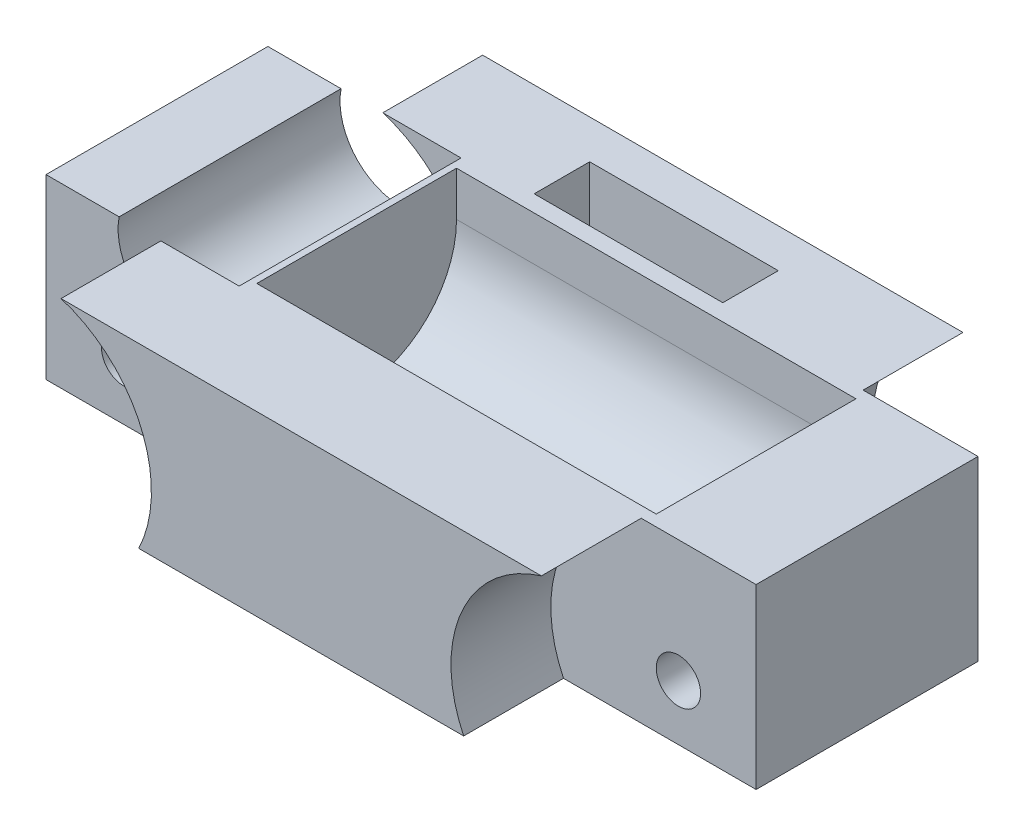
ISO-10303-21;
HEADER;
FILE_DESCRIPTION(('STEP AP214'),'2;1');
FILE_NAME('part.step','',(''),(''),'','','');
FILE_SCHEMA(('AUTOMOTIVE_DESIGN { 1 0 10303 214 1 1 1 1 }'));
ENDSEC;
DATA;
#1=APPLICATION_CONTEXT('core data for automotive mechanical design processes');
#2=APPLICATION_PROTOCOL_DEFINITION('international standard','automotive_design',2000,#1);
#3=PRODUCT_CONTEXT('',#1,'mechanical');
#4=PRODUCT('Part','Part','',(#3));
#5=PRODUCT_RELATED_PRODUCT_CATEGORY('part','',(#4));
#6=PRODUCT_DEFINITION_FORMATION('','',#4);
#7=PRODUCT_DEFINITION_CONTEXT('part definition',#1,'design');
#8=PRODUCT_DEFINITION('design','',#6,#7);
#9=PRODUCT_DEFINITION_SHAPE('','',#8);
#10=(LENGTH_UNIT() NAMED_UNIT(*) SI_UNIT(.MILLI.,.METRE.));
#11=(NAMED_UNIT(*) PLANE_ANGLE_UNIT() SI_UNIT($,.RADIAN.));
#12=(NAMED_UNIT(*) SI_UNIT($,.STERADIAN.) SOLID_ANGLE_UNIT());
#13=UNCERTAINTY_MEASURE_WITH_UNIT(LENGTH_MEASURE(1.E-05),#10,'distance_accuracy_value','');
#14=(GEOMETRIC_REPRESENTATION_CONTEXT(3) GLOBAL_UNCERTAINTY_ASSIGNED_CONTEXT((#13)) GLOBAL_UNIT_ASSIGNED_CONTEXT((#10,
#11,#12)) REPRESENTATION_CONTEXT('',''));
#15=CARTESIAN_POINT('',(0.,0.,0.));
#16=DIRECTION('',(0.,0.,1.));
#17=DIRECTION('',(1.,0.,0.));
#18=AXIS2_PLACEMENT_3D('',#15,#16,#17);
#19=CARTESIAN_POINT('',(0.,16.,0.));
#20=DIRECTION('',(0.,1.,0.));
#21=DIRECTION('',(0.,0.,1.));
#22=AXIS2_PLACEMENT_3D('',#19,#20,#21);
#23=PLANE('',#22);
#24=DIRECTION('',(-1.,0.,0.));
#25=VECTOR('',#24,1.);
#26=CARTESIAN_POINT('',(0.,16.,9.));
#27=LINE('',#26,#25);
#28=CARTESIAN_POINT('',(22.,16.,9.));
#29=VERTEX_POINT('',#28);
#30=CARTESIAN_POINT('',(-14.,16.,9.));
#31=VERTEX_POINT('',#30);
#32=EDGE_CURVE('E440',#29,#31,#27,.T.);
#33=ORIENTED_EDGE('',*,*,#32,.T.);
#34=DIRECTION('',(0.,0.,-1.));
#35=VECTOR('',#34,1.);
#36=CARTESIAN_POINT('',(-14.,16.,0.));
#37=LINE('',#36,#35);
#38=CARTESIAN_POINT('',(-14.,16.,-9.));
#39=VERTEX_POINT('',#38);
#40=EDGE_CURVE('E443',#31,#39,#37,.T.);
#41=ORIENTED_EDGE('',*,*,#40,.T.);
#42=DIRECTION('',(1.,0.,0.));
#43=VECTOR('',#42,1.);
#44=CARTESIAN_POINT('',(0.,16.,-9.));
#45=LINE('',#44,#43);
#46=CARTESIAN_POINT('',(22.,16.,-9.));
#47=VERTEX_POINT('',#46);
#48=EDGE_CURVE('E437',#39,#47,#45,.T.);
#49=ORIENTED_EDGE('',*,*,#48,.T.);
#50=DIRECTION('',(0.,0.,-1.));
#51=VECTOR('',#50,1.);
#52=CARTESIAN_POINT('',(22.,16.,0.));
#53=LINE('',#52,#51);
#54=EDGE_CURVE('E431',#29,#47,#53,.T.);
#55=ORIENTED_EDGE('',*,*,#54,.F.);
#56=EDGE_LOOP('',(#33,#41,#49,#55));
#57=FACE_BOUND('',#56,.T.);
#58=DIRECTION('',(1.,0.,0.));
#59=VECTOR('',#58,1.);
#60=CARTESIAN_POINT('',(8.5,16.,-10.5));
#61=LINE('',#60,#59);
#62=CARTESIAN_POINT('',(-8.5,16.,-10.5));
#63=VERTEX_POINT('',#62);
#64=CARTESIAN_POINT('',(8.5,16.,-10.5));
#65=VERTEX_POINT('',#64);
#66=EDGE_CURVE('E277',#63,#65,#61,.T.);
#67=ORIENTED_EDGE('',*,*,#66,.F.);
#68=DIRECTION('',(0.,0.,1.));
#69=VECTOR('',#68,1.);
#70=CARTESIAN_POINT('',(-8.5,16.,-10.5));
#71=LINE('',#70,#69);
#72=CARTESIAN_POINT('',(-8.5,16.,-15.5));
#73=VERTEX_POINT('',#72);
#74=EDGE_CURVE('E280',#73,#63,#71,.T.);
#75=ORIENTED_EDGE('',*,*,#74,.F.);
#76=DIRECTION('',(-1.,0.,0.));
#77=VECTOR('',#76,1.);
#78=CARTESIAN_POINT('',(8.5,16.,-15.5));
#79=LINE('',#78,#77);
#80=CARTESIAN_POINT('',(8.5,16.,-15.5));
#81=VERTEX_POINT('',#80);
#82=EDGE_CURVE('E309',#81,#73,#79,.T.);
#83=ORIENTED_EDGE('',*,*,#82,.F.);
#84=DIRECTION('',(0.,0.,-1.));
#85=VECTOR('',#84,1.);
#86=CARTESIAN_POINT('',(8.5,16.,-10.5));
#87=LINE('',#86,#85);
#88=EDGE_CURVE('E270',#65,#81,#87,.T.);
#89=ORIENTED_EDGE('',*,*,#88,.F.);
#90=EDGE_LOOP('',(#67,#75,#83,#89));
#91=FACE_BOUND('',#90,.T.);
#92=DIRECTION('',(0.,0.,1.));
#93=VECTOR('',#92,1.);
#94=CARTESIAN_POINT('',(-21.6458980337505,16.,-20.));
#95=LINE('',#94,#93);
#96=CARTESIAN_POINT('',(-21.6458980337505,16.,-10.));
#97=VERTEX_POINT('',#96);
#98=CARTESIAN_POINT('',(-21.6458980337505,16.,-19.));
#99=VERTEX_POINT('',#98);
#100=EDGE_CURVE('E243',#97,#99,#95,.F.);
#101=ORIENTED_EDGE('',*,*,#100,.F.);
#102=DIRECTION('',(1.,0.,0.));
#103=VECTOR('',#102,1.);
#104=CARTESIAN_POINT('',(0.,16.,-10.));
#105=LINE('',#104,#103);
#106=CARTESIAN_POINT('',(-14.591673086804,16.,-10.));
#107=VERTEX_POINT('',#106);
#108=EDGE_CURVE('E235',#97,#107,#105,.T.);
#109=ORIENTED_EDGE('',*,*,#108,.T.);
#110=DIRECTION('',(0.,0.,1.));
#111=VECTOR('',#110,1.);
#112=CARTESIAN_POINT('',(-14.591673086804,16.,-10.));
#113=LINE('',#112,#111);
#114=CARTESIAN_POINT('',(-14.591673086804,16.,10.));
#115=VERTEX_POINT('',#114);
#116=EDGE_CURVE('E224',#115,#107,#113,.F.);
#117=ORIENTED_EDGE('',*,*,#116,.F.);
#118=DIRECTION('',(1.,0.,0.));
#119=VECTOR('',#118,1.);
#120=CARTESIAN_POINT('',(0.,16.,10.));
#121=LINE('',#120,#119);
#122=CARTESIAN_POINT('',(-21.6458980337505,16.,10.));
#123=VERTEX_POINT('',#122);
#124=EDGE_CURVE('E244',#123,#115,#121,.T.);
#125=ORIENTED_EDGE('',*,*,#124,.F.);
#126=DIRECTION('',(0.,0.,-1.));
#127=VECTOR('',#126,1.);
#128=CARTESIAN_POINT('',(-21.6458980337505,16.,20.));
#129=LINE('',#128,#127);
#130=CARTESIAN_POINT('',(-21.6458980337505,16.,19.));
#131=VERTEX_POINT('',#130);
#132=EDGE_CURVE('E370',#123,#131,#129,.F.);
#133=ORIENTED_EDGE('',*,*,#132,.T.);
#134=DIRECTION('',(1.,0.,0.));
#135=VECTOR('',#134,1.);
#136=CARTESIAN_POINT('',(-32.,16.,19.));
#137=LINE('',#136,#135);
#138=CARTESIAN_POINT('',(21.6458980337503,16.,19.));
#139=VERTEX_POINT('',#138);
#140=EDGE_CURVE('E400',#131,#139,#137,.T.);
#141=ORIENTED_EDGE('',*,*,#140,.T.);
#142=DIRECTION('',(0.,0.,-1.));
#143=VECTOR('',#142,1.);
#144=CARTESIAN_POINT('',(21.6458980337503,16.,20.));
#145=LINE('',#144,#143);
#146=CARTESIAN_POINT('',(21.6458980337503,16.,10.));
#147=VERTEX_POINT('',#146);
#148=EDGE_CURVE('E388',#139,#147,#145,.T.);
#149=ORIENTED_EDGE('',*,*,#148,.T.);
#150=DIRECTION('',(1.,0.,0.));
#151=VECTOR('',#150,1.);
#152=CARTESIAN_POINT('',(0.,16.,10.));
#153=LINE('',#152,#151);
#154=CARTESIAN_POINT('',(32.,16.,10.));
#155=VERTEX_POINT('',#154);
#156=EDGE_CURVE('E382',#147,#155,#153,.T.);
#157=ORIENTED_EDGE('',*,*,#156,.T.);
#158=DIRECTION('',(0.,0.,-1.));
#159=VECTOR('',#158,1.);
#160=CARTESIAN_POINT('',(32.,16.,-19.));
#161=LINE('',#160,#159);
#162=CARTESIAN_POINT('',(32.,16.,-10.));
#163=VERTEX_POINT('',#162);
#164=EDGE_CURVE('E392',#155,#163,#161,.T.);
#165=ORIENTED_EDGE('',*,*,#164,.T.);
#166=DIRECTION('',(-1.,0.,0.));
#167=VECTOR('',#166,1.);
#168=CARTESIAN_POINT('',(0.,16.,-10.));
#169=LINE('',#168,#167);
#170=CARTESIAN_POINT('',(21.6458980337503,16.,-10.));
#171=VERTEX_POINT('',#170);
#172=EDGE_CURVE('E361',#163,#171,#169,.T.);
#173=ORIENTED_EDGE('',*,*,#172,.T.);
#174=DIRECTION('',(0.,0.,1.));
#175=VECTOR('',#174,1.);
#176=CARTESIAN_POINT('',(21.6458980337503,16.,-20.));
#177=LINE('',#176,#175);
#178=CARTESIAN_POINT('',(21.6458980337503,16.,-19.));
#179=VERTEX_POINT('',#178);
#180=EDGE_CURVE('E357',#179,#171,#177,.T.);
#181=ORIENTED_EDGE('',*,*,#180,.F.);
#182=DIRECTION('',(-1.,0.,0.));
#183=VECTOR('',#182,1.);
#184=CARTESIAN_POINT('',(-32.,16.,-19.));
#185=LINE('',#184,#183);
#186=EDGE_CURVE('E395',#179,#99,#185,.T.);
#187=ORIENTED_EDGE('',*,*,#186,.T.);
#188=EDGE_LOOP('',(#101,#109,#117,#125,#133,#141,#149,#157,#165,#173,#181,#187));
#189=FACE_BOUND('',#188,.T.);
#190=ADVANCED_FACE('F35',(#57,#91,#189),#23,.T.);
#191=CARTESIAN_POINT('',(0.,3.,0.));
#192=DIRECTION('',(0.,1.,0.));
#193=DIRECTION('',(0.,0.,1.));
#194=AXIS2_PLACEMENT_3D('',#191,#192,#193);
#195=PLANE('',#194);
#196=DIRECTION('',(1.,0.,0.));
#197=VECTOR('',#196,1.);
#198=CARTESIAN_POINT('',(8.5,3.,-10.5));
#199=LINE('',#198,#197);
#200=CARTESIAN_POINT('',(-8.5,3.,-10.5));
#201=VERTEX_POINT('',#200);
#202=CARTESIAN_POINT('',(-6.,3.,-10.5));
#203=VERTEX_POINT('',#202);
#204=EDGE_CURVE('E287',#201,#203,#199,.T.);
#205=ORIENTED_EDGE('',*,*,#204,.T.);
#206=DIRECTION('',(0.,0.,-1.));
#207=VECTOR('',#206,1.);
#208=CARTESIAN_POINT('',(-6.,3.,-17.));
#209=LINE('',#208,#207);
#210=CARTESIAN_POINT('',(-6.,3.,-15.5));
#211=VERTEX_POINT('',#210);
#212=EDGE_CURVE('E250',#203,#211,#209,.T.);
#213=ORIENTED_EDGE('',*,*,#212,.T.);
#214=DIRECTION('',(-1.,0.,0.));
#215=VECTOR('',#214,1.);
#216=CARTESIAN_POINT('',(8.5,3.,-15.5));
#217=LINE('',#216,#215);
#218=CARTESIAN_POINT('',(-8.5,3.,-15.5));
#219=VERTEX_POINT('',#218);
#220=EDGE_CURVE('E294',#211,#219,#217,.T.);
#221=ORIENTED_EDGE('',*,*,#220,.T.);
#222=DIRECTION('',(0.,0.,1.));
#223=VECTOR('',#222,1.);
#224=CARTESIAN_POINT('',(-8.5,3.,-10.5));
#225=LINE('',#224,#223);
#226=EDGE_CURVE('E283',#219,#201,#225,.T.);
#227=ORIENTED_EDGE('',*,*,#226,.T.);
#228=EDGE_LOOP('',(#205,#213,#221,#227));
#229=FACE_BOUND('',#228,.T.);
#230=ADVANCED_FACE('F506',(#229),#195,.T.);
#231=CARTESIAN_POINT('',(8.5,3.,-15.5));
#232=VERTEX_POINT('',#231);
#233=CARTESIAN_POINT('',(6.,3.,-15.5));
#234=VERTEX_POINT('',#233);
#235=EDGE_CURVE('E295',#232,#234,#217,.T.);
#236=ORIENTED_EDGE('',*,*,#235,.T.);
#237=DIRECTION('',(0.,0.,1.));
#238=VECTOR('',#237,1.);
#239=CARTESIAN_POINT('',(6.,3.,-17.));
#240=LINE('',#239,#238);
#241=CARTESIAN_POINT('',(6.,3.,-10.5));
#242=VERTEX_POINT('',#241);
#243=EDGE_CURVE('E253',#234,#242,#240,.T.);
#244=ORIENTED_EDGE('',*,*,#243,.T.);
#245=CARTESIAN_POINT('',(8.5,3.,-10.5));
#246=VERTEX_POINT('',#245);
#247=EDGE_CURVE('E286',#242,#246,#199,.T.);
#248=ORIENTED_EDGE('',*,*,#247,.T.);
#249=DIRECTION('',(0.,0.,-1.));
#250=VECTOR('',#249,1.);
#251=CARTESIAN_POINT('',(8.5,3.,-10.5));
#252=LINE('',#251,#250);
#253=EDGE_CURVE('E290',#246,#232,#252,.T.);
#254=ORIENTED_EDGE('',*,*,#253,.T.);
#255=EDGE_LOOP('',(#236,#244,#248,#254));
#256=FACE_BOUND('',#255,.T.);
#257=ADVANCED_FACE('F471',(#256),#195,.T.);
#258=DIRECTION('',(0.,0.,1.));
#259=VECTOR('',#258,1.);
#260=CARTESIAN_POINT('',(-25.408326913196,16.,-10.));
#261=LINE('',#260,#259);
#262=CARTESIAN_POINT('',(-25.408326913196,16.,-10.));
#263=VERTEX_POINT('',#262);
#264=CARTESIAN_POINT('',(-25.408326913196,16.,10.));
#265=VERTEX_POINT('',#264);
#266=EDGE_CURVE('E231',#263,#265,#261,.T.);
#267=ORIENTED_EDGE('',*,*,#266,.F.);
#268=DIRECTION('',(-1.,0.,0.));
#269=VECTOR('',#268,1.);
#270=CARTESIAN_POINT('',(0.,16.,-10.));
#271=LINE('',#270,#269);
#272=CARTESIAN_POINT('',(-32.,16.,-10.));
#273=VERTEX_POINT('',#272);
#274=EDGE_CURVE('E349',#263,#273,#271,.T.);
#275=ORIENTED_EDGE('',*,*,#274,.T.);
#276=DIRECTION('',(0.,0.,1.));
#277=VECTOR('',#276,1.);
#278=CARTESIAN_POINT('',(-32.,16.,-19.));
#279=LINE('',#278,#277);
#280=CARTESIAN_POINT('',(-32.,16.,10.));
#281=VERTEX_POINT('',#280);
#282=EDGE_CURVE('E398',#273,#281,#279,.T.);
#283=ORIENTED_EDGE('',*,*,#282,.T.);
#284=DIRECTION('',(1.,0.,0.));
#285=VECTOR('',#284,1.);
#286=CARTESIAN_POINT('',(0.,16.,10.));
#287=LINE('',#286,#285);
#288=EDGE_CURVE('E375',#281,#265,#287,.T.);
#289=ORIENTED_EDGE('',*,*,#288,.T.);
#290=EDGE_LOOP('',(#267,#275,#283,#289));
#291=FACE_BOUND('',#290,.T.);
#292=ADVANCED_FACE('F512',(#291),#23,.T.);
#293=CARTESIAN_POINT('',(-32.,16.,-19.));
#294=DIRECTION('',(1.,0.,0.));
#295=DIRECTION('',(0.,0.,-1.));
#296=AXIS2_PLACEMENT_3D('',#293,#294,#295);
#297=PLANE('',#296);
#298=DIRECTION('',(0.,1.,0.));
#299=VECTOR('',#298,1.);
#300=CARTESIAN_POINT('',(-32.,16.,-10.));
#301=LINE('',#300,#299);
#302=CARTESIAN_POINT('',(-32.,0.,-10.));
#303=VERTEX_POINT('',#302);
#304=EDGE_CURVE('E428',#303,#273,#301,.T.);
#305=ORIENTED_EDGE('',*,*,#304,.F.);
#306=DIRECTION('',(0.,0.,1.));
#307=VECTOR('',#306,1.);
#308=CARTESIAN_POINT('',(-32.,0.,-19.));
#309=LINE('',#308,#307);
#310=CARTESIAN_POINT('',(-32.,0.,10.));
#311=VERTEX_POINT('',#310);
#312=EDGE_CURVE('E408',#303,#311,#309,.T.);
#313=ORIENTED_EDGE('',*,*,#312,.T.);
#314=DIRECTION('',(0.,-1.,0.));
#315=VECTOR('',#314,1.);
#316=CARTESIAN_POINT('',(-32.,16.,10.));
#317=LINE('',#316,#315);
#318=EDGE_CURVE('E417',#281,#311,#317,.T.);
#319=ORIENTED_EDGE('',*,*,#318,.F.);
#320=ORIENTED_EDGE('',*,*,#282,.F.);
#321=EDGE_LOOP('',(#305,#313,#319,#320));
#322=FACE_BOUND('',#321,.T.);
#323=ADVANCED_FACE('F589',(#322),#297,.F.);
#324=CARTESIAN_POINT('',(32.,16.,-19.));
#325=DIRECTION('',(-1.,0.,0.));
#326=DIRECTION('',(0.,0.,1.));
#327=AXIS2_PLACEMENT_3D('',#324,#325,#326);
#328=PLANE('',#327);
#329=DIRECTION('',(0.,-1.,0.));
#330=VECTOR('',#329,1.);
#331=CARTESIAN_POINT('',(32.,16.,-10.));
#332=LINE('',#331,#330);
#333=CARTESIAN_POINT('',(32.,0.,-10.));
#334=VERTEX_POINT('',#333);
#335=EDGE_CURVE('E423',#163,#334,#332,.T.);
#336=ORIENTED_EDGE('',*,*,#335,.F.);
#337=ORIENTED_EDGE('',*,*,#164,.F.);
#338=DIRECTION('',(0.,1.,0.));
#339=VECTOR('',#338,1.);
#340=CARTESIAN_POINT('',(32.,16.,10.));
#341=LINE('',#340,#339);
#342=CARTESIAN_POINT('',(32.,0.,10.));
#343=VERTEX_POINT('',#342);
#344=EDGE_CURVE('E380',#343,#155,#341,.T.);
#345=ORIENTED_EDGE('',*,*,#344,.F.);
#346=DIRECTION('',(0.,0.,-1.));
#347=VECTOR('',#346,1.);
#348=CARTESIAN_POINT('',(32.,0.,-19.));
#349=LINE('',#348,#347);
#350=EDGE_CURVE('E391',#343,#334,#349,.T.);
#351=ORIENTED_EDGE('',*,*,#350,.T.);
#352=EDGE_LOOP('',(#336,#337,#345,#351));
#353=FACE_BOUND('',#352,.T.);
#354=ADVANCED_FACE('F594',(#353),#328,.F.);
#355=CARTESIAN_POINT('',(0.,0.,0.));
#356=DIRECTION('',(0.,1.,0.));
#357=DIRECTION('',(0.,0.,1.));
#358=AXIS2_PLACEMENT_3D('',#355,#356,#357);
#359=PLANE('',#358);
#360=DIRECTION('',(1.,0.,0.));
#361=VECTOR('',#360,1.);
#362=CARTESIAN_POINT('',(6.,0.,-17.));
#363=LINE('',#362,#361);
#364=CARTESIAN_POINT('',(-6.,0.,-17.));
#365=VERTEX_POINT('',#364);
#366=CARTESIAN_POINT('',(6.,0.,-17.));
#367=VERTEX_POINT('',#366);
#368=EDGE_CURVE('E260',#365,#367,#363,.T.);
#369=ORIENTED_EDGE('',*,*,#368,.F.);
#370=DIRECTION('',(0.,0.,-1.));
#371=VECTOR('',#370,1.);
#372=CARTESIAN_POINT('',(-6.,0.,-17.));
#373=LINE('',#372,#371);
#374=CARTESIAN_POINT('',(-6.,0.,-9.));
#375=VERTEX_POINT('',#374);
#376=EDGE_CURVE('E246',#375,#365,#373,.T.);
#377=ORIENTED_EDGE('',*,*,#376,.F.);
#378=DIRECTION('',(-1.,0.,0.));
#379=VECTOR('',#378,1.);
#380=CARTESIAN_POINT('',(6.,0.,-9.));
#381=LINE('',#380,#379);
#382=CARTESIAN_POINT('',(6.,0.,-9.));
#383=VERTEX_POINT('',#382);
#384=EDGE_CURVE('E254',#383,#375,#381,.T.);
#385=ORIENTED_EDGE('',*,*,#384,.F.);
#386=DIRECTION('',(0.,0.,1.));
#387=VECTOR('',#386,1.);
#388=CARTESIAN_POINT('',(6.,0.,-17.));
#389=LINE('',#388,#387);
#390=EDGE_CURVE('E263',#367,#383,#389,.T.);
#391=ORIENTED_EDGE('',*,*,#390,.F.);
#392=EDGE_LOOP('',(#369,#377,#385,#391));
#393=FACE_BOUND('',#392,.T.);
#394=DIRECTION('',(-1.,0.,0.));
#395=VECTOR('',#394,1.);
#396=CARTESIAN_POINT('',(0.,0.,-10.));
#397=LINE('',#396,#395);
#398=CARTESIAN_POINT('',(-14.643842411396,0.,-10.));
#399=VERTEX_POINT('',#398);
#400=EDGE_CURVE('E347',#399,#303,#397,.T.);
#401=ORIENTED_EDGE('',*,*,#400,.F.);
#402=DIRECTION('',(0.,0.,1.));
#403=VECTOR('',#402,1.);
#404=CARTESIAN_POINT('',(-14.643842411396,0.,-20.));
#405=LINE('',#404,#403);
#406=CARTESIAN_POINT('',(-14.643842411396,0.,-19.));
#407=VERTEX_POINT('',#406);
#408=EDGE_CURVE('E343',#399,#407,#405,.F.);
#409=ORIENTED_EDGE('',*,*,#408,.T.);
#410=DIRECTION('',(-1.,0.,0.));
#411=VECTOR('',#410,1.);
#412=CARTESIAN_POINT('',(-32.,0.,-19.));
#413=LINE('',#412,#411);
#414=CARTESIAN_POINT('',(14.643842411396,0.,-19.));
#415=VERTEX_POINT('',#414);
#416=EDGE_CURVE('E405',#415,#407,#413,.T.);
#417=ORIENTED_EDGE('',*,*,#416,.F.);
#418=DIRECTION('',(0.,0.,1.));
#419=VECTOR('',#418,1.);
#420=CARTESIAN_POINT('',(14.643842411396,0.,-20.));
#421=LINE('',#420,#419);
#422=CARTESIAN_POINT('',(14.643842411396,0.,-10.));
#423=VERTEX_POINT('',#422);
#424=EDGE_CURVE('E354',#415,#423,#421,.T.);
#425=ORIENTED_EDGE('',*,*,#424,.T.);
#426=DIRECTION('',(-1.,0.,0.));
#427=VECTOR('',#426,1.);
#428=CARTESIAN_POINT('',(0.,0.,-10.));
#429=LINE('',#428,#427);
#430=EDGE_CURVE('E359',#334,#423,#429,.T.);
#431=ORIENTED_EDGE('',*,*,#430,.F.);
#432=ORIENTED_EDGE('',*,*,#350,.F.);
#433=DIRECTION('',(1.,0.,0.));
#434=VECTOR('',#433,1.);
#435=CARTESIAN_POINT('',(0.,0.,10.));
#436=LINE('',#435,#434);
#437=CARTESIAN_POINT('',(14.643842411396,0.,10.));
#438=VERTEX_POINT('',#437);
#439=EDGE_CURVE('E402',#438,#343,#436,.T.);
#440=ORIENTED_EDGE('',*,*,#439,.F.);
#441=DIRECTION('',(0.,0.,-1.));
#442=VECTOR('',#441,1.);
#443=CARTESIAN_POINT('',(14.643842411396,0.,20.));
#444=LINE('',#443,#442);
#445=CARTESIAN_POINT('',(14.643842411396,0.,19.));
#446=VERTEX_POINT('',#445);
#447=EDGE_CURVE('E412',#446,#438,#444,.T.);
#448=ORIENTED_EDGE('',*,*,#447,.F.);
#449=DIRECTION('',(1.,0.,0.));
#450=VECTOR('',#449,1.);
#451=CARTESIAN_POINT('',(-32.,0.,19.));
#452=LINE('',#451,#450);
#453=CARTESIAN_POINT('',(-14.643842411396,0.,19.));
#454=VERTEX_POINT('',#453);
#455=EDGE_CURVE('E396',#454,#446,#452,.T.);
#456=ORIENTED_EDGE('',*,*,#455,.F.);
#457=DIRECTION('',(0.,0.,-1.));
#458=VECTOR('',#457,1.);
#459=CARTESIAN_POINT('',(-14.643842411396,0.,20.));
#460=LINE('',#459,#458);
#461=CARTESIAN_POINT('',(-14.643842411396,0.,10.));
#462=VERTEX_POINT('',#461);
#463=EDGE_CURVE('E368',#462,#454,#460,.F.);
#464=ORIENTED_EDGE('',*,*,#463,.F.);
#465=DIRECTION('',(1.,0.,0.));
#466=VECTOR('',#465,1.);
#467=CARTESIAN_POINT('',(0.,0.,10.));
#468=LINE('',#467,#466);
#469=EDGE_CURVE('E373',#311,#462,#468,.T.);
#470=ORIENTED_EDGE('',*,*,#469,.F.);
#471=ORIENTED_EDGE('',*,*,#312,.F.);
#472=EDGE_LOOP('',(#401,#409,#417,#425,#431,#432,#440,#448,#456,#464,#470,#471));
#473=FACE_BOUND('',#472,.T.);
#474=ADVANCED_FACE('F503',(#393,#473),#359,.F.);
#475=CARTESIAN_POINT('',(-32.,16.,-19.));
#476=DIRECTION('',(0.,0.,1.));
#477=DIRECTION('',(1.,0.,0.));
#478=AXIS2_PLACEMENT_3D('',#475,#476,#477);
#479=PLANE('',#478);
#480=ORIENTED_EDGE('',*,*,#416,.T.);
#481=CARTESIAN_POINT('',(-25.,4.99999999999993,-19.));
#482=DIRECTION('',(0.,0.,1.));
#483=DIRECTION('',(1.,0.,0.));
#484=AXIS2_PLACEMENT_3D('',#481,#482,#483);
#485=CIRCLE('',#484,11.5);
#486=EDGE_CURVE('E425',#407,#99,#485,.T.);
#487=ORIENTED_EDGE('',*,*,#486,.T.);
#488=ORIENTED_EDGE('',*,*,#186,.F.);
#489=CARTESIAN_POINT('',(25.,5.,-19.));
#490=DIRECTION('',(0.,0.,1.));
#491=DIRECTION('',(1.,0.,0.));
#492=AXIS2_PLACEMENT_3D('',#489,#490,#491);
#493=CIRCLE('',#492,11.5);
#494=EDGE_CURVE('E420',#179,#415,#493,.T.);
#495=ORIENTED_EDGE('',*,*,#494,.T.);
#496=EDGE_LOOP('',(#480,#487,#488,#495));
#497=FACE_BOUND('',#496,.T.);
#498=ADVANCED_FACE('F593',(#497),#479,.F.);
#499=CARTESIAN_POINT('',(-32.,16.,19.));
#500=DIRECTION('',(0.,0.,-1.));
#501=DIRECTION('',(-1.,0.,0.));
#502=AXIS2_PLACEMENT_3D('',#499,#500,#501);
#503=PLANE('',#502);
#504=CARTESIAN_POINT('',(-25.,4.99999999999993,19.));
#505=DIRECTION('',(0.,0.,-1.));
#506=DIRECTION('',(-1.,0.,0.));
#507=AXIS2_PLACEMENT_3D('',#504,#505,#506);
#508=CIRCLE('',#507,11.5);
#509=EDGE_CURVE('E415',#454,#131,#508,.F.);
#510=ORIENTED_EDGE('',*,*,#509,.F.);
#511=ORIENTED_EDGE('',*,*,#455,.T.);
#512=CARTESIAN_POINT('',(25.,5.,19.));
#513=DIRECTION('',(0.,0.,-1.));
#514=DIRECTION('',(-1.,0.,0.));
#515=AXIS2_PLACEMENT_3D('',#512,#513,#514);
#516=CIRCLE('',#515,11.5);
#517=EDGE_CURVE('E385',#139,#446,#516,.F.);
#518=ORIENTED_EDGE('',*,*,#517,.F.);
#519=ORIENTED_EDGE('',*,*,#140,.F.);
#520=EDGE_LOOP('',(#510,#511,#518,#519));
#521=FACE_BOUND('',#520,.T.);
#522=ADVANCED_FACE('F585',(#521),#503,.F.);
#523=CARTESIAN_POINT('',(25.,5.,20.));
#524=DIRECTION('',(0.,0.,-1.));
#525=DIRECTION('',(-1.,0.,0.));
#526=AXIS2_PLACEMENT_3D('',#523,#524,#525);
#527=CYLINDRICAL_SURFACE('',#526,11.5);
#528=ORIENTED_EDGE('',*,*,#517,.T.);
#529=ORIENTED_EDGE('',*,*,#447,.T.);
#530=CARTESIAN_POINT('',(25.,5.,10.));
#531=DIRECTION('',(0.,0.,1.));
#532=DIRECTION('',(1.,0.,0.));
#533=AXIS2_PLACEMENT_3D('',#530,#531,#532);
#534=CIRCLE('',#533,11.5);
#535=EDGE_CURVE('E378',#147,#438,#534,.T.);
#536=ORIENTED_EDGE('',*,*,#535,.F.);
#537=ORIENTED_EDGE('',*,*,#148,.F.);
#538=EDGE_LOOP('',(#528,#529,#536,#537));
#539=FACE_BOUND('',#538,.T.);
#540=ADVANCED_FACE('F582',(#539),#527,.F.);
#541=CARTESIAN_POINT('',(0.,0.,10.));
#542=DIRECTION('',(0.,0.,1.));
#543=DIRECTION('',(1.,0.,0.));
#544=AXIS2_PLACEMENT_3D('',#541,#542,#543);
#545=PLANE('',#544);
#546=CARTESIAN_POINT('',(25.,5.,10.));
#547=DIRECTION('',(0.,0.,1.));
#548=DIRECTION('',(1.,0.,0.));
#549=AXIS2_PLACEMENT_3D('',#546,#547,#548);
#550=CIRCLE('',#549,2.);
#551=CARTESIAN_POINT('',(27.,5.,10.));
#552=VERTEX_POINT('',#551);
#553=EDGE_CURVE('E337',#552,#552,#550,.T.);
#554=ORIENTED_EDGE('',*,*,#553,.F.);
#555=EDGE_LOOP('',(#554));
#556=FACE_BOUND('',#555,.T.);
#557=ORIENTED_EDGE('',*,*,#535,.T.);
#558=ORIENTED_EDGE('',*,*,#439,.T.);
#559=ORIENTED_EDGE('',*,*,#344,.T.);
#560=ORIENTED_EDGE('',*,*,#156,.F.);
#561=EDGE_LOOP('',(#557,#558,#559,#560));
#562=FACE_BOUND('',#561,.T.);
#563=ADVANCED_FACE('F578',(#556,#562),#545,.T.);
#564=CARTESIAN_POINT('',(-25.,4.99999999999993,20.));
#565=DIRECTION('',(0.,0.,-1.));
#566=DIRECTION('',(-1.,0.,0.));
#567=AXIS2_PLACEMENT_3D('',#564,#565,#566);
#568=CYLINDRICAL_SURFACE('',#567,11.5);
#569=CARTESIAN_POINT('',(-25.,4.99999999999993,10.));
#570=DIRECTION('',(0.,0.,1.));
#571=DIRECTION('',(1.,0.,0.));
#572=AXIS2_PLACEMENT_3D('',#569,#570,#571);
#573=CIRCLE('',#572,11.5);
#574=CARTESIAN_POINT('',(-15.6274437406276,11.6637218703137,10.));
#575=VERTEX_POINT('',#574);
#576=EDGE_CURVE('E365',#462,#575,#573,.T.);
#577=ORIENTED_EDGE('',*,*,#576,.F.);
#578=ORIENTED_EDGE('',*,*,#463,.T.);
#579=ORIENTED_EDGE('',*,*,#509,.T.);
#580=ORIENTED_EDGE('',*,*,#132,.F.);
#581=EDGE_CURVE('E364',#575,#123,#573,.T.);
#582=ORIENTED_EDGE('',*,*,#581,.F.);
#583=EDGE_LOOP('',(#577,#578,#579,#580,#582));
#584=FACE_BOUND('',#583,.T.);
#585=ADVANCED_FACE('F574',(#584),#568,.F.);
#586=CARTESIAN_POINT('',(0.,0.,10.));
#587=DIRECTION('',(0.,0.,1.));
#588=DIRECTION('',(1.,0.,0.));
#589=AXIS2_PLACEMENT_3D('',#586,#587,#588);
#590=PLANE('',#589);
#591=CARTESIAN_POINT('',(-20.,15.,10.));
#592=DIRECTION('',(0.,0.,1.));
#593=DIRECTION('',(1.,0.,0.));
#594=AXIS2_PLACEMENT_3D('',#591,#592,#593);
#595=CIRCLE('',#594,5.5);
#596=EDGE_CURVE('E239',#265,#575,#595,.T.);
#597=ORIENTED_EDGE('',*,*,#596,.F.);
#598=ORIENTED_EDGE('',*,*,#288,.F.);
#599=ORIENTED_EDGE('',*,*,#318,.T.);
#600=ORIENTED_EDGE('',*,*,#469,.T.);
#601=ORIENTED_EDGE('',*,*,#576,.T.);
#602=EDGE_LOOP('',(#597,#598,#599,#600,#601));
#603=FACE_BOUND('',#602,.T.);
#604=CARTESIAN_POINT('',(-25.,4.99999999999993,10.));
#605=DIRECTION('',(0.,0.,1.));
#606=DIRECTION('',(1.,0.,0.));
#607=AXIS2_PLACEMENT_3D('',#604,#605,#606);
#608=CIRCLE('',#607,2.);
#609=CARTESIAN_POINT('',(-23.,4.99999999999993,10.));
#610=VERTEX_POINT('',#609);
#611=EDGE_CURVE('E333',#610,#610,#608,.T.);
#612=ORIENTED_EDGE('',*,*,#611,.F.);
#613=EDGE_LOOP('',(#612));
#614=FACE_BOUND('',#613,.T.);
#615=ADVANCED_FACE('F570',(#603,#614),#590,.T.);
#616=CARTESIAN_POINT('',(25.,5.,-20.));
#617=DIRECTION('',(0.,0.,1.));
#618=DIRECTION('',(1.,0.,0.));
#619=AXIS2_PLACEMENT_3D('',#616,#617,#618);
#620=CYLINDRICAL_SURFACE('',#619,11.5);
#621=ORIENTED_EDGE('',*,*,#180,.T.);
#622=CARTESIAN_POINT('',(25.,5.,-10.));
#623=DIRECTION('',(0.,0.,1.));
#624=DIRECTION('',(1.,0.,0.));
#625=AXIS2_PLACEMENT_3D('',#622,#623,#624);
#626=CIRCLE('',#625,11.5);
#627=EDGE_CURVE('E351',#171,#423,#626,.T.);
#628=ORIENTED_EDGE('',*,*,#627,.T.);
#629=ORIENTED_EDGE('',*,*,#424,.F.);
#630=ORIENTED_EDGE('',*,*,#494,.F.);
#631=EDGE_LOOP('',(#621,#628,#629,#630));
#632=FACE_BOUND('',#631,.T.);
#633=ADVANCED_FACE('F566',(#632),#620,.F.);
#634=CARTESIAN_POINT('',(0.,0.,-10.));
#635=DIRECTION('',(0.,0.,-1.));
#636=DIRECTION('',(1.,0.,0.));
#637=AXIS2_PLACEMENT_3D('',#634,#635,#636);
#638=PLANE('',#637);
#639=CARTESIAN_POINT('',(25.,5.,-10.));
#640=DIRECTION('',(0.,0.,-1.));
#641=DIRECTION('',(-1.,0.,0.));
#642=AXIS2_PLACEMENT_3D('',#639,#640,#641);
#643=CIRCLE('',#642,2.);
#644=CARTESIAN_POINT('',(23.,5.,-10.));
#645=VERTEX_POINT('',#644);
#646=EDGE_CURVE('E336',#645,#645,#643,.T.);
#647=ORIENTED_EDGE('',*,*,#646,.F.);
#648=EDGE_LOOP('',(#647));
#649=FACE_BOUND('',#648,.T.);
#650=ORIENTED_EDGE('',*,*,#335,.T.);
#651=ORIENTED_EDGE('',*,*,#430,.T.);
#652=ORIENTED_EDGE('',*,*,#627,.F.);
#653=ORIENTED_EDGE('',*,*,#172,.F.);
#654=EDGE_LOOP('',(#650,#651,#652,#653));
#655=FACE_BOUND('',#654,.T.);
#656=ADVANCED_FACE('F562',(#649,#655),#638,.T.);
#657=CARTESIAN_POINT('',(-25.,4.99999999999993,-20.));
#658=DIRECTION('',(0.,0.,1.));
#659=DIRECTION('',(1.,0.,0.));
#660=AXIS2_PLACEMENT_3D('',#657,#658,#659);
#661=CYLINDRICAL_SURFACE('',#660,11.5);
#662=ORIENTED_EDGE('',*,*,#100,.T.);
#663=ORIENTED_EDGE('',*,*,#486,.F.);
#664=ORIENTED_EDGE('',*,*,#408,.F.);
#665=CARTESIAN_POINT('',(-25.,4.99999999999993,-10.));
#666=DIRECTION('',(0.,0.,1.));
#667=DIRECTION('',(1.,0.,0.));
#668=AXIS2_PLACEMENT_3D('',#665,#666,#667);
#669=CIRCLE('',#668,11.5);
#670=CARTESIAN_POINT('',(-15.6274437406276,11.6637218703137,-10.));
#671=VERTEX_POINT('',#670);
#672=EDGE_CURVE('E340',#399,#671,#669,.T.);
#673=ORIENTED_EDGE('',*,*,#672,.T.);
#674=EDGE_CURVE('E237',#671,#97,#669,.T.);
#675=ORIENTED_EDGE('',*,*,#674,.T.);
#676=EDGE_LOOP('',(#662,#663,#664,#673,#675));
#677=FACE_BOUND('',#676,.T.);
#678=ADVANCED_FACE('F558',(#677),#661,.F.);
#679=CARTESIAN_POINT('',(0.,0.,-10.));
#680=DIRECTION('',(0.,0.,-1.));
#681=DIRECTION('',(1.,0.,0.));
#682=AXIS2_PLACEMENT_3D('',#679,#680,#681);
#683=PLANE('',#682);
#684=CARTESIAN_POINT('',(-20.,15.,-10.));
#685=DIRECTION('',(0.,0.,-1.));
#686=DIRECTION('',(-1.,0.,0.));
#687=AXIS2_PLACEMENT_3D('',#684,#685,#686);
#688=CIRCLE('',#687,5.5);
#689=EDGE_CURVE('E11',#671,#263,#688,.T.);
#690=ORIENTED_EDGE('',*,*,#689,.F.);
#691=ORIENTED_EDGE('',*,*,#672,.F.);
#692=ORIENTED_EDGE('',*,*,#400,.T.);
#693=ORIENTED_EDGE('',*,*,#304,.T.);
#694=ORIENTED_EDGE('',*,*,#274,.F.);
#695=EDGE_LOOP('',(#690,#691,#692,#693,#694));
#696=FACE_BOUND('',#695,.T.);
#697=CARTESIAN_POINT('',(-25.,4.99999999999993,-10.));
#698=DIRECTION('',(0.,0.,-1.));
#699=DIRECTION('',(-1.,0.,0.));
#700=AXIS2_PLACEMENT_3D('',#697,#698,#699);
#701=CIRCLE('',#700,2.);
#702=CARTESIAN_POINT('',(-27.,4.99999999999993,-10.));
#703=VERTEX_POINT('',#702);
#704=EDGE_CURVE('E330',#703,#703,#701,.T.);
#705=ORIENTED_EDGE('',*,*,#704,.F.);
#706=EDGE_LOOP('',(#705));
#707=FACE_BOUND('',#706,.T.);
#708=ADVANCED_FACE('F554',(#696,#707),#683,.T.);
#709=CARTESIAN_POINT('',(25.,5.,-19.));
#710=DIRECTION('',(0.,0.,1.));
#711=DIRECTION('',(1.,0.,0.));
#712=AXIS2_PLACEMENT_3D('',#709,#710,#711);
#713=CYLINDRICAL_SURFACE('',#712,2.);
#714=ORIENTED_EDGE('',*,*,#553,.T.);
#715=EDGE_LOOP('',(#714));
#716=FACE_BOUND('',#715,.T.);
#717=ORIENTED_EDGE('',*,*,#646,.T.);
#718=EDGE_LOOP('',(#717));
#719=FACE_BOUND('',#718,.T.);
#720=ADVANCED_FACE('F550',(#716,#719),#713,.F.);
#721=CARTESIAN_POINT('',(-25.,4.99999999999993,-19.));
#722=DIRECTION('',(0.,0.,1.));
#723=DIRECTION('',(1.,0.,0.));
#724=AXIS2_PLACEMENT_3D('',#721,#722,#723);
#725=CYLINDRICAL_SURFACE('',#724,2.);
#726=ORIENTED_EDGE('',*,*,#611,.T.);
#727=EDGE_LOOP('',(#726));
#728=FACE_BOUND('',#727,.T.);
#729=ORIENTED_EDGE('',*,*,#704,.T.);
#730=EDGE_LOOP('',(#729));
#731=FACE_BOUND('',#730,.T.);
#732=ADVANCED_FACE('F546',(#728,#731),#725,.F.);
#733=CARTESIAN_POINT('',(-14.,12.,0.));
#734=DIRECTION('',(1.,0.,0.));
#735=DIRECTION('',(0.,0.,-1.));
#736=AXIS2_PLACEMENT_3D('',#733,#734,#735);
#737=CYLINDRICAL_SURFACE('',#736,9.);
#738=DIRECTION('',(1.,0.,0.));
#739=VECTOR('',#738,1.);
#740=CARTESIAN_POINT('',(-14.,12.,-9.));
#741=LINE('',#740,#739);
#742=CARTESIAN_POINT('',(-14.,12.,-9.));
#743=VERTEX_POINT('',#742);
#744=CARTESIAN_POINT('',(22.,12.,-9.));
#745=VERTEX_POINT('',#744);
#746=EDGE_CURVE('E327',#743,#745,#741,.T.);
#747=ORIENTED_EDGE('',*,*,#746,.F.);
#748=CARTESIAN_POINT('',(-14.,12.,0.));
#749=DIRECTION('',(1.,0.,0.));
#750=DIRECTION('',(0.,0.,-1.));
#751=AXIS2_PLACEMENT_3D('',#748,#749,#750);
#752=CIRCLE('',#751,9.);
#753=CARTESIAN_POINT('',(-14.,12.,9.));
#754=VERTEX_POINT('',#753);
#755=EDGE_CURVE('E319',#754,#743,#752,.T.);
#756=ORIENTED_EDGE('',*,*,#755,.F.);
#757=DIRECTION('',(1.,0.,0.));
#758=VECTOR('',#757,1.);
#759=CARTESIAN_POINT('',(-14.,12.,9.));
#760=LINE('',#759,#758);
#761=CARTESIAN_POINT('',(22.,12.,9.));
#762=VERTEX_POINT('',#761);
#763=EDGE_CURVE('E328',#754,#762,#760,.T.);
#764=ORIENTED_EDGE('',*,*,#763,.T.);
#765=CARTESIAN_POINT('',(22.,12.,0.));
#766=DIRECTION('',(1.,0.,0.));
#767=DIRECTION('',(0.,0.,-1.));
#768=AXIS2_PLACEMENT_3D('',#765,#766,#767);
#769=CIRCLE('',#768,9.);
#770=EDGE_CURVE('E312',#762,#745,#769,.T.);
#771=ORIENTED_EDGE('',*,*,#770,.T.);
#772=EDGE_LOOP('',(#747,#756,#764,#771));
#773=FACE_BOUND('',#772,.T.);
#774=ADVANCED_FACE('F539',(#773),#737,.F.);
#775=CARTESIAN_POINT('',(-14.,0.,9.));
#776=DIRECTION('',(0.,0.,-1.));
#777=DIRECTION('',(-1.,0.,0.));
#778=AXIS2_PLACEMENT_3D('',#775,#776,#777);
#779=PLANE('',#778);
#780=DIRECTION('',(0.,1.,0.));
#781=VECTOR('',#780,1.);
#782=CARTESIAN_POINT('',(22.,0.,9.));
#783=LINE('',#782,#781);
#784=EDGE_CURVE('E317',#762,#29,#783,.T.);
#785=ORIENTED_EDGE('',*,*,#784,.F.);
#786=ORIENTED_EDGE('',*,*,#763,.F.);
#787=DIRECTION('',(0.,1.,0.));
#788=VECTOR('',#787,1.);
#789=CARTESIAN_POINT('',(-14.,0.,9.));
#790=LINE('',#789,#788);
#791=EDGE_CURVE('E324',#754,#31,#790,.T.);
#792=ORIENTED_EDGE('',*,*,#791,.T.);
#793=ORIENTED_EDGE('',*,*,#32,.F.);
#794=EDGE_LOOP('',(#785,#786,#792,#793));
#795=FACE_BOUND('',#794,.T.);
#796=ADVANCED_FACE('F536',(#795),#779,.T.);
#797=CARTESIAN_POINT('',(-14.,0.,-9.));
#798=DIRECTION('',(0.,0.,1.));
#799=DIRECTION('',(1.,0.,0.));
#800=AXIS2_PLACEMENT_3D('',#797,#798,#799);
#801=PLANE('',#800);
#802=DIRECTION('',(0.,-1.,0.));
#803=VECTOR('',#802,1.);
#804=CARTESIAN_POINT('',(-14.,0.,-9.));
#805=LINE('',#804,#803);
#806=EDGE_CURVE('E322',#39,#743,#805,.T.);
#807=ORIENTED_EDGE('',*,*,#806,.T.);
#808=ORIENTED_EDGE('',*,*,#746,.T.);
#809=DIRECTION('',(0.,-1.,0.));
#810=VECTOR('',#809,1.);
#811=CARTESIAN_POINT('',(22.,0.,-9.));
#812=LINE('',#811,#810);
#813=EDGE_CURVE('E315',#47,#745,#812,.T.);
#814=ORIENTED_EDGE('',*,*,#813,.F.);
#815=ORIENTED_EDGE('',*,*,#48,.F.);
#816=EDGE_LOOP('',(#807,#808,#814,#815));
#817=FACE_BOUND('',#816,.T.);
#818=ADVANCED_FACE('F534',(#817),#801,.T.);
#819=CARTESIAN_POINT('',(-14.,0.,0.));
#820=DIRECTION('',(1.,0.,0.));
#821=DIRECTION('',(0.,0.,-1.));
#822=AXIS2_PLACEMENT_3D('',#819,#820,#821);
#823=PLANE('',#822);
#824=ORIENTED_EDGE('',*,*,#791,.F.);
#825=ORIENTED_EDGE('',*,*,#755,.T.);
#826=ORIENTED_EDGE('',*,*,#806,.F.);
#827=ORIENTED_EDGE('',*,*,#40,.F.);
#828=EDGE_LOOP('',(#824,#825,#826,#827));
#829=FACE_BOUND('',#828,.T.);
#830=ADVANCED_FACE('F530',(#829),#823,.T.);
#831=CARTESIAN_POINT('',(22.,0.,0.));
#832=DIRECTION('',(1.,0.,0.));
#833=DIRECTION('',(0.,0.,-1.));
#834=AXIS2_PLACEMENT_3D('',#831,#832,#833);
#835=PLANE('',#834);
#836=ORIENTED_EDGE('',*,*,#54,.T.);
#837=ORIENTED_EDGE('',*,*,#813,.T.);
#838=ORIENTED_EDGE('',*,*,#770,.F.);
#839=ORIENTED_EDGE('',*,*,#784,.T.);
#840=EDGE_LOOP('',(#836,#837,#838,#839));
#841=FACE_BOUND('',#840,.T.);
#842=ADVANCED_FACE('F527',(#841),#835,.F.);
#843=CARTESIAN_POINT('',(-8.5,16.001,-10.5));
#844=DIRECTION('',(1.,0.,0.));
#845=DIRECTION('',(0.,0.,-1.));
#846=AXIS2_PLACEMENT_3D('',#843,#844,#845);
#847=PLANE('',#846);
#848=ORIENTED_EDGE('',*,*,#74,.T.);
#849=DIRECTION('',(0.,-1.,0.));
#850=VECTOR('',#849,1.);
#851=CARTESIAN_POINT('',(-8.5,16.001,-10.5));
#852=LINE('',#851,#850);
#853=EDGE_CURVE('E307',#63,#201,#852,.T.);
#854=ORIENTED_EDGE('',*,*,#853,.T.);
#855=ORIENTED_EDGE('',*,*,#226,.F.);
#856=DIRECTION('',(0.,-1.,0.));
#857=VECTOR('',#856,1.);
#858=CARTESIAN_POINT('',(-8.5,16.001,-15.5));
#859=LINE('',#858,#857);
#860=EDGE_CURVE('E298',#73,#219,#859,.T.);
#861=ORIENTED_EDGE('',*,*,#860,.F.);
#862=EDGE_LOOP('',(#848,#854,#855,#861));
#863=FACE_BOUND('',#862,.T.);
#864=ADVANCED_FACE('F487',(#863),#847,.T.);
#865=CARTESIAN_POINT('',(8.5,16.001,-10.5));
#866=DIRECTION('',(0.,0.,-1.));
#867=DIRECTION('',(-1.,0.,0.));
#868=AXIS2_PLACEMENT_3D('',#865,#866,#867);
#869=PLANE('',#868);
#870=ORIENTED_EDGE('',*,*,#66,.T.);
#871=DIRECTION('',(0.,-1.,0.));
#872=VECTOR('',#871,1.);
#873=CARTESIAN_POINT('',(8.5,16.001,-10.5));
#874=LINE('',#873,#872);
#875=EDGE_CURVE('E304',#65,#246,#874,.T.);
#876=ORIENTED_EDGE('',*,*,#875,.T.);
#877=ORIENTED_EDGE('',*,*,#247,.F.);
#878=EDGE_CURVE('E291',#203,#242,#199,.T.);
#879=ORIENTED_EDGE('',*,*,#878,.F.);
#880=ORIENTED_EDGE('',*,*,#204,.F.);
#881=ORIENTED_EDGE('',*,*,#853,.F.);
#882=EDGE_LOOP('',(#870,#876,#877,#879,#880,#881));
#883=FACE_BOUND('',#882,.T.);
#884=ADVANCED_FACE('F474',(#883),#869,.T.);
#885=CARTESIAN_POINT('',(8.5,16.001,-10.5));
#886=DIRECTION('',(-1.,0.,0.));
#887=DIRECTION('',(0.,0.,1.));
#888=AXIS2_PLACEMENT_3D('',#885,#886,#887);
#889=PLANE('',#888);
#890=ORIENTED_EDGE('',*,*,#88,.T.);
#891=DIRECTION('',(0.,-1.,0.));
#892=VECTOR('',#891,1.);
#893=CARTESIAN_POINT('',(8.5,16.001,-15.5));
#894=LINE('',#893,#892);
#895=EDGE_CURVE('E302',#81,#232,#894,.T.);
#896=ORIENTED_EDGE('',*,*,#895,.T.);
#897=ORIENTED_EDGE('',*,*,#253,.F.);
#898=ORIENTED_EDGE('',*,*,#875,.F.);
#899=EDGE_LOOP('',(#890,#896,#897,#898));
#900=FACE_BOUND('',#899,.T.);
#901=ADVANCED_FACE('F478',(#900),#889,.T.);
#902=CARTESIAN_POINT('',(8.5,16.001,-15.5));
#903=DIRECTION('',(0.,0.,1.));
#904=DIRECTION('',(1.,0.,0.));
#905=AXIS2_PLACEMENT_3D('',#902,#903,#904);
#906=PLANE('',#905);
#907=ORIENTED_EDGE('',*,*,#82,.T.);
#908=ORIENTED_EDGE('',*,*,#860,.T.);
#909=ORIENTED_EDGE('',*,*,#220,.F.);
#910=EDGE_CURVE('E299',#234,#211,#217,.T.);
#911=ORIENTED_EDGE('',*,*,#910,.F.);
#912=ORIENTED_EDGE('',*,*,#235,.F.);
#913=ORIENTED_EDGE('',*,*,#895,.F.);
#914=EDGE_LOOP('',(#907,#908,#909,#911,#912,#913));
#915=FACE_BOUND('',#914,.T.);
#916=ADVANCED_FACE('F482',(#915),#906,.T.);
#917=CARTESIAN_POINT('',(-6.,3.,-17.));
#918=DIRECTION('',(-1.,0.,0.));
#919=DIRECTION('',(0.,0.,1.));
#920=AXIS2_PLACEMENT_3D('',#917,#918,#919);
#921=PLANE('',#920);
#922=DIRECTION('',(0.,-1.,0.));
#923=VECTOR('',#922,1.);
#924=CARTESIAN_POINT('',(-6.,3.,-17.));
#925=LINE('',#924,#923);
#926=CARTESIAN_POINT('',(-6.,1.5,-17.));
#927=VERTEX_POINT('',#926);
#928=EDGE_CURVE('E257',#927,#365,#925,.T.);
#929=ORIENTED_EDGE('',*,*,#928,.F.);
#930=CARTESIAN_POINT('',(-6.,1.5,-15.5));
#931=DIRECTION('',(-1.,0.,0.));
#932=DIRECTION('',(0.,0.,1.));
#933=AXIS2_PLACEMENT_3D('',#930,#931,#932);
#934=CIRCLE('',#933,1.5);
#935=EDGE_CURVE('E453',#927,#211,#934,.F.);
#936=ORIENTED_EDGE('',*,*,#935,.T.);
#937=ORIENTED_EDGE('',*,*,#212,.F.);
#938=CARTESIAN_POINT('',(-6.,1.5,-10.5));
#939=DIRECTION('',(-1.,0.,0.));
#940=DIRECTION('',(0.,0.,1.));
#941=AXIS2_PLACEMENT_3D('',#938,#939,#940);
#942=CIRCLE('',#941,1.5);
#943=CARTESIAN_POINT('',(-6.,1.5,-9.));
#944=VERTEX_POINT('',#943);
#945=EDGE_CURVE('E57',#203,#944,#942,.F.);
#946=ORIENTED_EDGE('',*,*,#945,.T.);
#947=DIRECTION('',(0.,-1.,0.));
#948=VECTOR('',#947,1.);
#949=CARTESIAN_POINT('',(-6.,3.,-9.));
#950=LINE('',#949,#948);
#951=EDGE_CURVE('E268',#944,#375,#950,.T.);
#952=ORIENTED_EDGE('',*,*,#951,.T.);
#953=ORIENTED_EDGE('',*,*,#376,.T.);
#954=EDGE_LOOP('',(#929,#936,#937,#946,#952,#953));
#955=FACE_BOUND('',#954,.T.);
#956=ADVANCED_FACE('F505',(#955),#921,.F.);
#957=CARTESIAN_POINT('',(6.,3.,-9.));
#958=DIRECTION('',(0.,0.,1.));
#959=DIRECTION('',(1.,0.,0.));
#960=AXIS2_PLACEMENT_3D('',#957,#958,#959);
#961=PLANE('',#960);
#962=ORIENTED_EDGE('',*,*,#951,.F.);
#963=DIRECTION('',(-1.,0.,0.));
#964=VECTOR('',#963,1.);
#965=CARTESIAN_POINT('',(6.,1.5,-9.));
#966=LINE('',#965,#964);
#967=CARTESIAN_POINT('',(6.,1.5,-9.));
#968=VERTEX_POINT('',#967);
#969=EDGE_CURVE('E43',#944,#968,#966,.F.);
#970=ORIENTED_EDGE('',*,*,#969,.T.);
#971=DIRECTION('',(0.,-1.,0.));
#972=VECTOR('',#971,1.);
#973=CARTESIAN_POINT('',(6.,3.,-9.));
#974=LINE('',#973,#972);
#975=EDGE_CURVE('E271',#968,#383,#974,.T.);
#976=ORIENTED_EDGE('',*,*,#975,.T.);
#977=ORIENTED_EDGE('',*,*,#384,.T.);
#978=EDGE_LOOP('',(#962,#970,#976,#977));
#979=FACE_BOUND('',#978,.T.);
#980=ADVANCED_FACE('F457',(#979),#961,.F.);
#981=CARTESIAN_POINT('',(6.,3.,-17.));
#982=DIRECTION('',(1.,0.,0.));
#983=DIRECTION('',(0.,0.,-1.));
#984=AXIS2_PLACEMENT_3D('',#981,#982,#983);
#985=PLANE('',#984);
#986=ORIENTED_EDGE('',*,*,#243,.F.);
#987=CARTESIAN_POINT('',(6.,1.5,-15.5));
#988=DIRECTION('',(1.,0.,0.));
#989=DIRECTION('',(0.,0.,-1.));
#990=AXIS2_PLACEMENT_3D('',#987,#988,#989);
#991=CIRCLE('',#990,1.5);
#992=CARTESIAN_POINT('',(6.,1.5,-17.));
#993=VERTEX_POINT('',#992);
#994=EDGE_CURVE('E448',#234,#993,#991,.F.);
#995=ORIENTED_EDGE('',*,*,#994,.T.);
#996=DIRECTION('',(0.,-1.,0.));
#997=VECTOR('',#996,1.);
#998=CARTESIAN_POINT('',(6.,3.,-17.));
#999=LINE('',#998,#997);
#1000=EDGE_CURVE('E273',#993,#367,#999,.T.);
#1001=ORIENTED_EDGE('',*,*,#1000,.T.);
#1002=ORIENTED_EDGE('',*,*,#390,.T.);
#1003=ORIENTED_EDGE('',*,*,#975,.F.);
#1004=CARTESIAN_POINT('',(6.,1.5,-10.5));
#1005=DIRECTION('',(1.,0.,0.));
#1006=DIRECTION('',(0.,0.,-1.));
#1007=AXIS2_PLACEMENT_3D('',#1004,#1005,#1006);
#1008=CIRCLE('',#1007,1.5);
#1009=EDGE_CURVE('E446',#968,#242,#1008,.F.);
#1010=ORIENTED_EDGE('',*,*,#1009,.T.);
#1011=EDGE_LOOP('',(#986,#995,#1001,#1002,#1003,#1010));
#1012=FACE_BOUND('',#1011,.T.);
#1013=ADVANCED_FACE('F462',(#1012),#985,.F.);
#1014=CARTESIAN_POINT('',(6.,3.,-17.));
#1015=DIRECTION('',(0.,0.,-1.));
#1016=DIRECTION('',(-1.,0.,0.));
#1017=AXIS2_PLACEMENT_3D('',#1014,#1015,#1016);
#1018=PLANE('',#1017);
#1019=ORIENTED_EDGE('',*,*,#1000,.F.);
#1020=DIRECTION('',(1.,0.,0.));
#1021=VECTOR('',#1020,1.);
#1022=CARTESIAN_POINT('',(6.,1.5,-17.));
#1023=LINE('',#1022,#1021);
#1024=EDGE_CURVE('E450',#993,#927,#1023,.F.);
#1025=ORIENTED_EDGE('',*,*,#1024,.T.);
#1026=ORIENTED_EDGE('',*,*,#928,.T.);
#1027=ORIENTED_EDGE('',*,*,#368,.T.);
#1028=EDGE_LOOP('',(#1019,#1025,#1026,#1027));
#1029=FACE_BOUND('',#1028,.T.);
#1030=ADVANCED_FACE('F498',(#1029),#1018,.F.);
#1031=CARTESIAN_POINT('',(0.,1.5,-15.5));
#1032=DIRECTION('',(1.,0.,0.));
#1033=DIRECTION('',(0.,0.,-1.));
#1034=AXIS2_PLACEMENT_3D('',#1031,#1032,#1033);
#1035=CYLINDRICAL_SURFACE('',#1034,1.5);
#1036=ORIENTED_EDGE('',*,*,#935,.F.);
#1037=ORIENTED_EDGE('',*,*,#1024,.F.);
#1038=ORIENTED_EDGE('',*,*,#994,.F.);
#1039=ORIENTED_EDGE('',*,*,#910,.T.);
#1040=EDGE_LOOP('',(#1036,#1037,#1038,#1039));
#1041=FACE_BOUND('',#1040,.T.);
#1042=ADVANCED_FACE('F494',(#1041),#1035,.F.);
#1043=CARTESIAN_POINT('',(0.,1.5,-10.5));
#1044=DIRECTION('',(-1.,0.,0.));
#1045=DIRECTION('',(0.,0.,1.));
#1046=AXIS2_PLACEMENT_3D('',#1043,#1044,#1045);
#1047=CYLINDRICAL_SURFACE('',#1046,1.5);
#1048=ORIENTED_EDGE('',*,*,#1009,.F.);
#1049=ORIENTED_EDGE('',*,*,#969,.F.);
#1050=ORIENTED_EDGE('',*,*,#945,.F.);
#1051=ORIENTED_EDGE('',*,*,#878,.T.);
#1052=EDGE_LOOP('',(#1048,#1049,#1050,#1051));
#1053=FACE_BOUND('',#1052,.T.);
#1054=ADVANCED_FACE('F37',(#1053),#1047,.F.);
#1055=CARTESIAN_POINT('',(-20.,15.,-10.));
#1056=DIRECTION('',(0.,0.,1.));
#1057=DIRECTION('',(1.,0.,0.));
#1058=AXIS2_PLACEMENT_3D('',#1055,#1056,#1057);
#1059=CYLINDRICAL_SURFACE('',#1058,5.5);
#1060=ORIENTED_EDGE('',*,*,#266,.T.);
#1061=ORIENTED_EDGE('',*,*,#596,.T.);
#1062=EDGE_CURVE('E227',#575,#115,#595,.T.);
#1063=ORIENTED_EDGE('',*,*,#1062,.T.);
#1064=ORIENTED_EDGE('',*,*,#116,.T.);
#1065=CARTESIAN_POINT('',(-20.,15.,-10.));
#1066=DIRECTION('',(0.,0.,1.));
#1067=DIRECTION('',(1.,0.,0.));
#1068=AXIS2_PLACEMENT_3D('',#1065,#1066,#1067);
#1069=CIRCLE('',#1068,5.5);
#1070=EDGE_CURVE('E49',#671,#107,#1069,.T.);
#1071=ORIENTED_EDGE('',*,*,#1070,.F.);
#1072=ORIENTED_EDGE('',*,*,#689,.T.);
#1073=EDGE_LOOP('',(#1060,#1061,#1063,#1064,#1071,#1072));
#1074=FACE_BOUND('',#1073,.T.);
#1075=ADVANCED_FACE('F225',(#1074),#1059,.F.);
#1076=CARTESIAN_POINT('',(-20.,15.,-10.));
#1077=DIRECTION('',(0.,0.,1.));
#1078=DIRECTION('',(1.,0.,0.));
#1079=AXIS2_PLACEMENT_3D('',#1076,#1077,#1078);
#1080=PLANE('',#1079);
#1081=ORIENTED_EDGE('',*,*,#674,.F.);
#1082=ORIENTED_EDGE('',*,*,#1070,.T.);
#1083=ORIENTED_EDGE('',*,*,#108,.F.);
#1084=EDGE_LOOP('',(#1081,#1082,#1083));
#1085=FACE_BOUND('',#1084,.T.);
#1086=ADVANCED_FACE('F234',(#1085),#1080,.T.);
#1087=CARTESIAN_POINT('',(-20.,15.,10.));
#1088=DIRECTION('',(0.,0.,1.));
#1089=DIRECTION('',(1.,0.,0.));
#1090=AXIS2_PLACEMENT_3D('',#1087,#1088,#1089);
#1091=PLANE('',#1090);
#1092=ORIENTED_EDGE('',*,*,#124,.T.);
#1093=ORIENTED_EDGE('',*,*,#1062,.F.);
#1094=ORIENTED_EDGE('',*,*,#581,.T.);
#1095=EDGE_LOOP('',(#1092,#1093,#1094));
#1096=FACE_BOUND('',#1095,.T.);
#1097=ADVANCED_FACE('F620',(#1096),#1091,.F.);
#1098=CLOSED_SHELL('',(#190,#230,#257,#292,#323,#354,#474,#498,#522,#540,#563,#585,#615,#633,
#656,#678,#708,#720,#732,#774,#796,#818,#830,#842,#864,#884,#901,#916,#956,#980,#1013,#1030,
#1042,#1054,#1075,#1086,#1097));
#1099=MANIFOLD_SOLID_BREP('B2',#1098);
#1100=ADVANCED_BREP_SHAPE_REPRESENTATION('',(#18,#1099),#14);
#1101=SHAPE_DEFINITION_REPRESENTATION(#9,#1100);
ENDSEC;
END-ISO-10303-21;
